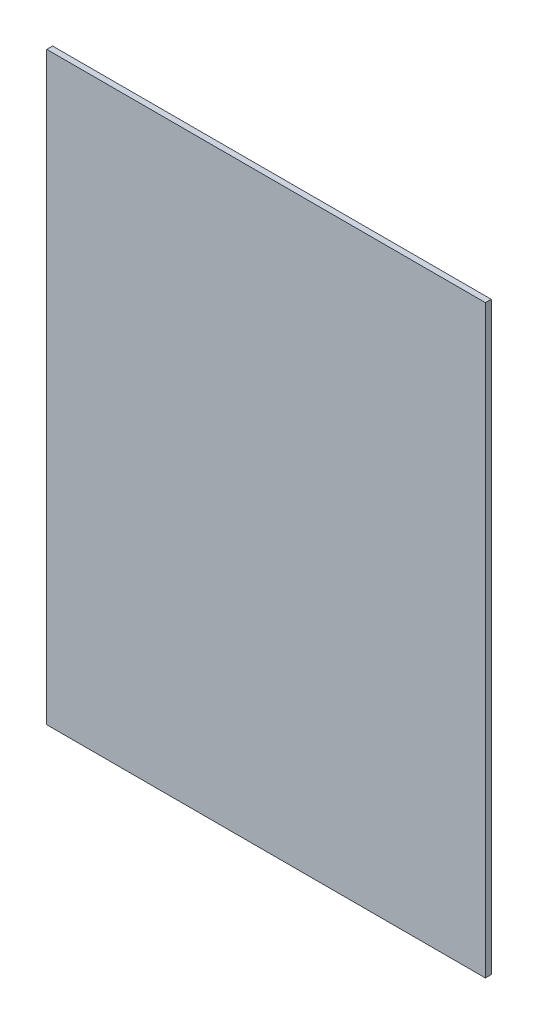
ISO-10303-21;
HEADER;
FILE_DESCRIPTION(('STEP AP214'),'2;1');
FILE_NAME('part.step','',(''),(''),'','','');
FILE_SCHEMA(('AUTOMOTIVE_DESIGN { 1 0 10303 214 1 1 1 1 }'));
ENDSEC;
DATA;
#1=APPLICATION_CONTEXT('core data for automotive mechanical design processes');
#2=APPLICATION_PROTOCOL_DEFINITION('international standard','automotive_design',2000,#1);
#3=PRODUCT_CONTEXT('',#1,'mechanical');
#4=PRODUCT('Part','Part','',(#3));
#5=PRODUCT_RELATED_PRODUCT_CATEGORY('part','',(#4));
#6=PRODUCT_DEFINITION_FORMATION('','',#4);
#7=PRODUCT_DEFINITION_CONTEXT('part definition',#1,'design');
#8=PRODUCT_DEFINITION('design','',#6,#7);
#9=PRODUCT_DEFINITION_SHAPE('','',#8);
#10=(LENGTH_UNIT() NAMED_UNIT(*) SI_UNIT(.MILLI.,.METRE.));
#11=(NAMED_UNIT(*) PLANE_ANGLE_UNIT() SI_UNIT($,.RADIAN.));
#12=(NAMED_UNIT(*) SI_UNIT($,.STERADIAN.) SOLID_ANGLE_UNIT());
#13=UNCERTAINTY_MEASURE_WITH_UNIT(LENGTH_MEASURE(1.E-05),#10,'distance_accuracy_value','');
#14=(GEOMETRIC_REPRESENTATION_CONTEXT(3) GLOBAL_UNCERTAINTY_ASSIGNED_CONTEXT((#13)) GLOBAL_UNIT_ASSIGNED_CONTEXT((#10,
#11,#12)) REPRESENTATION_CONTEXT('',''));
#15=CARTESIAN_POINT('',(0.,0.,0.));
#16=DIRECTION('',(0.,0.,1.));
#17=DIRECTION('',(1.,0.,0.));
#18=AXIS2_PLACEMENT_3D('',#15,#16,#17);
#19=CARTESIAN_POINT('',(75.,100.,2.));
#20=DIRECTION('',(0.,-1.,0.));
#21=DIRECTION('',(0.,0.,-1.));
#22=AXIS2_PLACEMENT_3D('',#19,#20,#21);
#23=PLANE('',#22);
#24=DIRECTION('',(-1.,0.,0.));
#25=VECTOR('',#24,1.);
#26=CARTESIAN_POINT('',(75.,100.,0.));
#27=LINE('',#26,#25);
#28=CARTESIAN_POINT('',(75.,100.,0.));
#29=VERTEX_POINT('',#28);
#30=CARTESIAN_POINT('',(-75.,100.,0.));
#31=VERTEX_POINT('',#30);
#32=EDGE_CURVE('E104',#29,#31,#27,.T.);
#33=ORIENTED_EDGE('',*,*,#32,.T.);
#34=DIRECTION('',(0.,0.,-1.));
#35=VECTOR('',#34,1.);
#36=CARTESIAN_POINT('',(-75.,100.,2.));
#37=LINE('',#36,#35);
#38=CARTESIAN_POINT('',(-75.,100.,2.));
#39=VERTEX_POINT('',#38);
#40=EDGE_CURVE('E11',#39,#31,#37,.T.);
#41=ORIENTED_EDGE('',*,*,#40,.F.);
#42=DIRECTION('',(-1.,0.,0.));
#43=VECTOR('',#42,1.);
#44=CARTESIAN_POINT('',(75.,100.,2.));
#45=LINE('',#44,#43);
#46=CARTESIAN_POINT('',(75.,100.,2.));
#47=VERTEX_POINT('',#46);
#48=EDGE_CURVE('E92',#47,#39,#45,.T.);
#49=ORIENTED_EDGE('',*,*,#48,.F.);
#50=DIRECTION('',(0.,0.,-1.));
#51=VECTOR('',#50,1.);
#52=CARTESIAN_POINT('',(75.,100.,2.));
#53=LINE('',#52,#51);
#54=EDGE_CURVE('E100',#47,#29,#53,.T.);
#55=ORIENTED_EDGE('',*,*,#54,.T.);
#56=EDGE_LOOP('',(#33,#41,#49,#55));
#57=FACE_BOUND('',#56,.T.);
#58=ADVANCED_FACE('F41',(#57),#23,.F.);
#59=CARTESIAN_POINT('',(-75.,-100.,2.));
#60=DIRECTION('',(1.,0.,0.));
#61=DIRECTION('',(0.,0.,-1.));
#62=AXIS2_PLACEMENT_3D('',#59,#60,#61);
#63=PLANE('',#62);
#64=DIRECTION('',(0.,-1.,0.));
#65=VECTOR('',#64,1.);
#66=CARTESIAN_POINT('',(-75.,-100.,0.));
#67=LINE('',#66,#65);
#68=CARTESIAN_POINT('',(-75.,-100.,0.));
#69=VERTEX_POINT('',#68);
#70=EDGE_CURVE('E96',#31,#69,#67,.T.);
#71=ORIENTED_EDGE('',*,*,#70,.T.);
#72=DIRECTION('',(0.,0.,-1.));
#73=VECTOR('',#72,1.);
#74=CARTESIAN_POINT('',(-75.,-100.,2.));
#75=LINE('',#74,#73);
#76=CARTESIAN_POINT('',(-75.,-100.,2.));
#77=VERTEX_POINT('',#76);
#78=EDGE_CURVE('E49',#77,#69,#75,.T.);
#79=ORIENTED_EDGE('',*,*,#78,.F.);
#80=DIRECTION('',(0.,-1.,0.));
#81=VECTOR('',#80,1.);
#82=CARTESIAN_POINT('',(-75.,-100.,2.));
#83=LINE('',#82,#81);
#84=EDGE_CURVE('E87',#39,#77,#83,.T.);
#85=ORIENTED_EDGE('',*,*,#84,.F.);
#86=ORIENTED_EDGE('',*,*,#40,.T.);
#87=EDGE_LOOP('',(#71,#79,#85,#86));
#88=FACE_BOUND('',#87,.T.);
#89=ADVANCED_FACE('F95',(#88),#63,.F.);
#90=CARTESIAN_POINT('',(75.,-100.,2.));
#91=DIRECTION('',(0.,1.,0.));
#92=DIRECTION('',(0.,0.,1.));
#93=AXIS2_PLACEMENT_3D('',#90,#91,#92);
#94=PLANE('',#93);
#95=DIRECTION('',(1.,0.,0.));
#96=VECTOR('',#95,1.);
#97=CARTESIAN_POINT('',(75.,-100.,0.));
#98=LINE('',#97,#96);
#99=CARTESIAN_POINT('',(75.,-100.,0.));
#100=VERTEX_POINT('',#99);
#101=EDGE_CURVE('E74',#69,#100,#98,.T.);
#102=ORIENTED_EDGE('',*,*,#101,.T.);
#103=DIRECTION('',(0.,0.,-1.));
#104=VECTOR('',#103,1.);
#105=CARTESIAN_POINT('',(75.,-100.,2.));
#106=LINE('',#105,#104);
#107=CARTESIAN_POINT('',(75.,-100.,2.));
#108=VERTEX_POINT('',#107);
#109=EDGE_CURVE('E97',#108,#100,#106,.T.);
#110=ORIENTED_EDGE('',*,*,#109,.F.);
#111=DIRECTION('',(1.,0.,0.));
#112=VECTOR('',#111,1.);
#113=CARTESIAN_POINT('',(75.,-100.,2.));
#114=LINE('',#113,#112);
#115=EDGE_CURVE('E90',#77,#108,#114,.T.);
#116=ORIENTED_EDGE('',*,*,#115,.F.);
#117=ORIENTED_EDGE('',*,*,#78,.T.);
#118=EDGE_LOOP('',(#102,#110,#116,#117));
#119=FACE_BOUND('',#118,.T.);
#120=ADVANCED_FACE('F98',(#119),#94,.F.);
#121=CARTESIAN_POINT('',(75.,-100.,2.));
#122=DIRECTION('',(-1.,0.,0.));
#123=DIRECTION('',(0.,0.,1.));
#124=AXIS2_PLACEMENT_3D('',#121,#122,#123);
#125=PLANE('',#124);
#126=DIRECTION('',(0.,1.,0.));
#127=VECTOR('',#126,1.);
#128=CARTESIAN_POINT('',(75.,-100.,0.));
#129=LINE('',#128,#127);
#130=EDGE_CURVE('E80',#100,#29,#129,.T.);
#131=ORIENTED_EDGE('',*,*,#130,.T.);
#132=ORIENTED_EDGE('',*,*,#54,.F.);
#133=DIRECTION('',(0.,1.,0.));
#134=VECTOR('',#133,1.);
#135=CARTESIAN_POINT('',(75.,-100.,2.));
#136=LINE('',#135,#134);
#137=EDGE_CURVE('E57',#108,#47,#136,.T.);
#138=ORIENTED_EDGE('',*,*,#137,.F.);
#139=ORIENTED_EDGE('',*,*,#109,.T.);
#140=EDGE_LOOP('',(#131,#132,#138,#139));
#141=FACE_BOUND('',#140,.T.);
#142=ADVANCED_FACE('F111',(#141),#125,.F.);
#143=CARTESIAN_POINT('',(0.,0.,2.));
#144=DIRECTION('',(0.,0.,-1.));
#145=DIRECTION('',(-1.,0.,0.));
#146=AXIS2_PLACEMENT_3D('',#143,#144,#145);
#147=PLANE('',#146);
#148=ORIENTED_EDGE('',*,*,#48,.T.);
#149=ORIENTED_EDGE('',*,*,#84,.T.);
#150=ORIENTED_EDGE('',*,*,#115,.T.);
#151=ORIENTED_EDGE('',*,*,#137,.T.);
#152=EDGE_LOOP('',(#148,#149,#150,#151));
#153=FACE_BOUND('',#152,.T.);
#154=ADVANCED_FACE('F88',(#153),#147,.F.);
#155=CARTESIAN_POINT('',(0.,0.,0.));
#156=DIRECTION('',(0.,0.,-1.));
#157=DIRECTION('',(-1.,0.,0.));
#158=AXIS2_PLACEMENT_3D('',#155,#156,#157);
#159=PLANE('',#158);
#160=ORIENTED_EDGE('',*,*,#32,.F.);
#161=ORIENTED_EDGE('',*,*,#130,.F.);
#162=ORIENTED_EDGE('',*,*,#101,.F.);
#163=ORIENTED_EDGE('',*,*,#70,.F.);
#164=EDGE_LOOP('',(#160,#161,#162,#163));
#165=FACE_BOUND('',#164,.T.);
#166=ADVANCED_FACE('F114',(#165),#159,.T.);
#167=CLOSED_SHELL('',(#58,#89,#120,#142,#154,#166));
#168=MANIFOLD_SOLID_BREP('B2',#167);
#169=ADVANCED_BREP_SHAPE_REPRESENTATION('',(#18,#168),#14);
#170=SHAPE_DEFINITION_REPRESENTATION(#9,#169);
ENDSEC;
END-ISO-10303-21;
